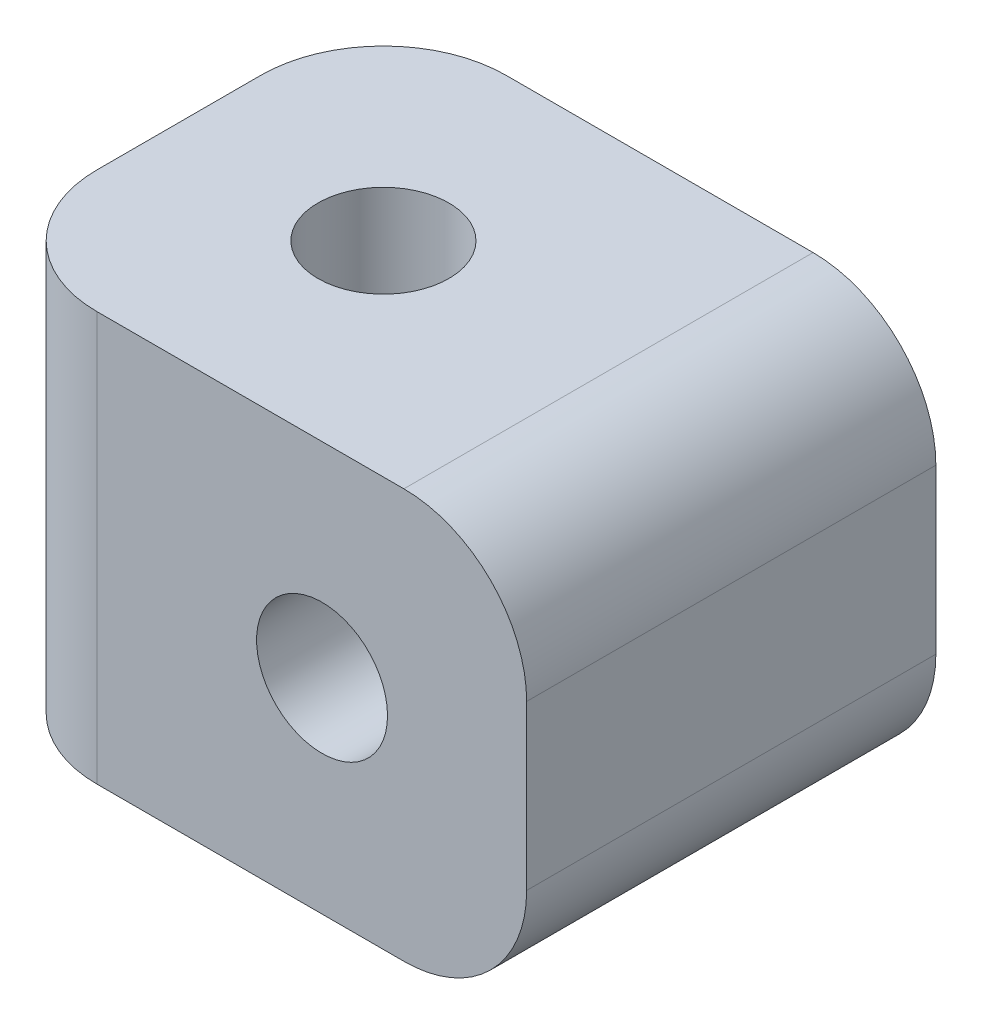
ISO-10303-21;
HEADER;
FILE_DESCRIPTION(('STEP AP214'),'2;1');
FILE_NAME('part.step','',(''),(''),'','','');
FILE_SCHEMA(('AUTOMOTIVE_DESIGN { 1 0 10303 214 1 1 1 1 }'));
ENDSEC;
DATA;
#1=APPLICATION_CONTEXT('core data for automotive mechanical design processes');
#2=APPLICATION_PROTOCOL_DEFINITION('international standard','automotive_design',2000,#1);
#3=PRODUCT_CONTEXT('',#1,'mechanical');
#4=PRODUCT('Part','Part','',(#3));
#5=PRODUCT_RELATED_PRODUCT_CATEGORY('part','',(#4));
#6=PRODUCT_DEFINITION_FORMATION('','',#4);
#7=PRODUCT_DEFINITION_CONTEXT('part definition',#1,'design');
#8=PRODUCT_DEFINITION('design','',#6,#7);
#9=PRODUCT_DEFINITION_SHAPE('','',#8);
#10=(LENGTH_UNIT() NAMED_UNIT(*) SI_UNIT(.MILLI.,.METRE.));
#11=(NAMED_UNIT(*) PLANE_ANGLE_UNIT() SI_UNIT($,.RADIAN.));
#12=(NAMED_UNIT(*) SI_UNIT($,.STERADIAN.) SOLID_ANGLE_UNIT());
#13=UNCERTAINTY_MEASURE_WITH_UNIT(LENGTH_MEASURE(1.E-05),#10,'distance_accuracy_value','');
#14=(GEOMETRIC_REPRESENTATION_CONTEXT(3) GLOBAL_UNCERTAINTY_ASSIGNED_CONTEXT((#13)) GLOBAL_UNIT_ASSIGNED_CONTEXT((#10,
#11,#12)) REPRESENTATION_CONTEXT('',''));
#15=CARTESIAN_POINT('',(0.,0.,0.));
#16=DIRECTION('',(0.,0.,1.));
#17=DIRECTION('',(1.,0.,0.));
#18=AXIS2_PLACEMENT_3D('',#15,#16,#17);
#19=CARTESIAN_POINT('',(0.,10.,0.));
#20=DIRECTION('',(1.,0.,0.));
#21=DIRECTION('',(0.,0.,-1.));
#22=AXIS2_PLACEMENT_3D('',#19,#20,#21);
#23=PLANE('',#22);
#24=DIRECTION('',(0.,0.,1.));
#25=VECTOR('',#24,1.);
#26=CARTESIAN_POINT('',(0.,10.,0.));
#27=LINE('',#26,#25);
#28=CARTESIAN_POINT('',(0.,10.,3.));
#29=VERTEX_POINT('',#28);
#30=CARTESIAN_POINT('',(0.,10.,7.));
#31=VERTEX_POINT('',#30);
#32=EDGE_CURVE('E118',#29,#31,#27,.T.);
#33=ORIENTED_EDGE('',*,*,#32,.F.);
#34=DIRECTION('',(0.,-1.,0.));
#35=VECTOR('',#34,1.);
#36=CARTESIAN_POINT('',(0.,10.,3.));
#37=LINE('',#36,#35);
#38=CARTESIAN_POINT('',(0.,0.,3.));
#39=VERTEX_POINT('',#38);
#40=EDGE_CURVE('E103',#29,#39,#37,.T.);
#41=ORIENTED_EDGE('',*,*,#40,.T.);
#42=DIRECTION('',(0.,0.,1.));
#43=VECTOR('',#42,1.);
#44=CARTESIAN_POINT('',(0.,0.,0.));
#45=LINE('',#44,#43);
#46=CARTESIAN_POINT('',(0.,0.,7.));
#47=VERTEX_POINT('',#46);
#48=EDGE_CURVE('E115',#39,#47,#45,.T.);
#49=ORIENTED_EDGE('',*,*,#48,.T.);
#50=DIRECTION('',(0.,-1.,0.));
#51=VECTOR('',#50,1.);
#52=CARTESIAN_POINT('',(0.,10.,7.));
#53=LINE('',#52,#51);
#54=EDGE_CURVE('E120',#47,#31,#53,.F.);
#55=ORIENTED_EDGE('',*,*,#54,.T.);
#56=EDGE_LOOP('',(#33,#41,#49,#55));
#57=FACE_BOUND('',#56,.T.);
#58=ADVANCED_FACE('F33',(#57),#23,.F.);
#59=CARTESIAN_POINT('',(0.,10.,10.));
#60=DIRECTION('',(0.,0.,-1.));
#61=DIRECTION('',(-1.,0.,0.));
#62=AXIS2_PLACEMENT_3D('',#59,#60,#61);
#63=PLANE('',#62);
#64=CARTESIAN_POINT('',(8.5,5.,10.));
#65=DIRECTION('',(0.,0.,1.));
#66=DIRECTION('',(1.,0.,0.));
#67=AXIS2_PLACEMENT_3D('',#64,#65,#66);
#68=CIRCLE('',#67,1.6);
#69=CARTESIAN_POINT('',(10.1,5.,10.));
#70=VERTEX_POINT('',#69);
#71=EDGE_CURVE('E130',#70,#70,#68,.T.);
#72=ORIENTED_EDGE('',*,*,#71,.F.);
#73=EDGE_LOOP('',(#72));
#74=FACE_BOUND('',#73,.T.);
#75=DIRECTION('',(1.,0.,0.));
#76=VECTOR('',#75,1.);
#77=CARTESIAN_POINT('',(0.,10.,10.));
#78=LINE('',#77,#76);
#79=CARTESIAN_POINT('',(3.,10.,10.));
#80=VERTEX_POINT('',#79);
#81=CARTESIAN_POINT('',(10.5,10.,10.));
#82=VERTEX_POINT('',#81);
#83=EDGE_CURVE('E165',#80,#82,#78,.T.);
#84=ORIENTED_EDGE('',*,*,#83,.F.);
#85=DIRECTION('',(0.,-1.,0.));
#86=VECTOR('',#85,1.);
#87=CARTESIAN_POINT('',(3.,10.,10.));
#88=LINE('',#87,#86);
#89=CARTESIAN_POINT('',(3.,0.,10.));
#90=VERTEX_POINT('',#89);
#91=EDGE_CURVE('E159',#80,#90,#88,.T.);
#92=ORIENTED_EDGE('',*,*,#91,.T.);
#93=DIRECTION('',(1.,0.,0.));
#94=VECTOR('',#93,1.);
#95=CARTESIAN_POINT('',(0.,0.,10.));
#96=LINE('',#95,#94);
#97=CARTESIAN_POINT('',(10.5,0.,10.));
#98=VERTEX_POINT('',#97);
#99=EDGE_CURVE('E124',#90,#98,#96,.T.);
#100=ORIENTED_EDGE('',*,*,#99,.T.);
#101=CARTESIAN_POINT('',(10.5,3.,10.));
#102=DIRECTION('',(0.,0.,-1.));
#103=DIRECTION('',(-1.,0.,0.));
#104=AXIS2_PLACEMENT_3D('',#101,#102,#103);
#105=CIRCLE('',#104,3.);
#106=CARTESIAN_POINT('',(13.5,3.,10.));
#107=VERTEX_POINT('',#106);
#108=EDGE_CURVE('E48',#98,#107,#105,.F.);
#109=ORIENTED_EDGE('',*,*,#108,.T.);
#110=DIRECTION('',(0.,-1.,0.));
#111=VECTOR('',#110,1.);
#112=CARTESIAN_POINT('',(13.5,10.,10.));
#113=LINE('',#112,#111);
#114=CARTESIAN_POINT('',(13.5,7.,10.));
#115=VERTEX_POINT('',#114);
#116=EDGE_CURVE('E140',#115,#107,#113,.T.);
#117=ORIENTED_EDGE('',*,*,#116,.F.);
#118=CARTESIAN_POINT('',(10.5,7.,10.));
#119=DIRECTION('',(0.,0.,-1.));
#120=DIRECTION('',(-1.,0.,0.));
#121=AXIS2_PLACEMENT_3D('',#118,#119,#120);
#122=CIRCLE('',#121,3.);
#123=EDGE_CURVE('E156',#115,#82,#122,.F.);
#124=ORIENTED_EDGE('',*,*,#123,.T.);
#125=EDGE_LOOP('',(#84,#92,#100,#109,#117,#124));
#126=FACE_BOUND('',#125,.T.);
#127=ADVANCED_FACE('F163',(#74,#126),#63,.F.);
#128=CARTESIAN_POINT('',(13.5,10.,0.));
#129=DIRECTION('',(-1.,0.,0.));
#130=DIRECTION('',(0.,0.,1.));
#131=AXIS2_PLACEMENT_3D('',#128,#129,#130);
#132=PLANE('',#131);
#133=ORIENTED_EDGE('',*,*,#116,.T.);
#134=DIRECTION('',(0.,0.,-1.));
#135=VECTOR('',#134,1.);
#136=CARTESIAN_POINT('',(13.5,3.,0.));
#137=LINE('',#136,#135);
#138=CARTESIAN_POINT('',(13.5,3.,0.));
#139=VERTEX_POINT('',#138);
#140=EDGE_CURVE('E11',#107,#139,#137,.T.);
#141=ORIENTED_EDGE('',*,*,#140,.T.);
#142=DIRECTION('',(0.,-1.,0.));
#143=VECTOR('',#142,1.);
#144=CARTESIAN_POINT('',(13.5,10.,0.));
#145=LINE('',#144,#143);
#146=CARTESIAN_POINT('',(13.5,7.,0.));
#147=VERTEX_POINT('',#146);
#148=EDGE_CURVE('E137',#147,#139,#145,.T.);
#149=ORIENTED_EDGE('',*,*,#148,.F.);
#150=DIRECTION('',(0.,0.,-1.));
#151=VECTOR('',#150,1.);
#152=CARTESIAN_POINT('',(13.5,7.,10.));
#153=LINE('',#152,#151);
#154=EDGE_CURVE('E41',#147,#115,#153,.F.);
#155=ORIENTED_EDGE('',*,*,#154,.T.);
#156=EDGE_LOOP('',(#133,#141,#149,#155));
#157=FACE_BOUND('',#156,.T.);
#158=ADVANCED_FACE('F172',(#157),#132,.F.);
#159=CARTESIAN_POINT('',(0.,10.,0.));
#160=DIRECTION('',(0.,0.,1.));
#161=DIRECTION('',(1.,0.,0.));
#162=AXIS2_PLACEMENT_3D('',#159,#160,#161);
#163=PLANE('',#162);
#164=CARTESIAN_POINT('',(8.5,5.,0.));
#165=DIRECTION('',(0.,0.,1.));
#166=DIRECTION('',(1.,0.,0.));
#167=AXIS2_PLACEMENT_3D('',#164,#165,#166);
#168=CIRCLE('',#167,1.6);
#169=CARTESIAN_POINT('',(10.1,5.,0.));
#170=VERTEX_POINT('',#169);
#171=EDGE_CURVE('E125',#170,#170,#168,.T.);
#172=ORIENTED_EDGE('',*,*,#171,.T.);
#173=EDGE_LOOP('',(#172));
#174=FACE_BOUND('',#173,.T.);
#175=DIRECTION('',(-1.,0.,0.));
#176=VECTOR('',#175,1.);
#177=CARTESIAN_POINT('',(0.,0.,0.));
#178=LINE('',#177,#176);
#179=CARTESIAN_POINT('',(10.5,0.,0.));
#180=VERTEX_POINT('',#179);
#181=CARTESIAN_POINT('',(3.,0.,0.));
#182=VERTEX_POINT('',#181);
#183=EDGE_CURVE('E127',#180,#182,#178,.T.);
#184=ORIENTED_EDGE('',*,*,#183,.T.);
#185=DIRECTION('',(0.,-1.,0.));
#186=VECTOR('',#185,1.);
#187=CARTESIAN_POINT('',(3.,10.,0.));
#188=LINE('',#187,#186);
#189=CARTESIAN_POINT('',(3.,10.,0.));
#190=VERTEX_POINT('',#189);
#191=EDGE_CURVE('E104',#182,#190,#188,.F.);
#192=ORIENTED_EDGE('',*,*,#191,.T.);
#193=DIRECTION('',(-1.,0.,0.));
#194=VECTOR('',#193,1.);
#195=CARTESIAN_POINT('',(0.,10.,0.));
#196=LINE('',#195,#194);
#197=CARTESIAN_POINT('',(10.5,10.,0.));
#198=VERTEX_POINT('',#197);
#199=EDGE_CURVE('E133',#198,#190,#196,.T.);
#200=ORIENTED_EDGE('',*,*,#199,.F.);
#201=CARTESIAN_POINT('',(10.5,7.,0.));
#202=DIRECTION('',(0.,0.,1.));
#203=DIRECTION('',(1.,0.,0.));
#204=AXIS2_PLACEMENT_3D('',#201,#202,#203);
#205=CIRCLE('',#204,3.);
#206=EDGE_CURVE('E109',#198,#147,#205,.F.);
#207=ORIENTED_EDGE('',*,*,#206,.T.);
#208=ORIENTED_EDGE('',*,*,#148,.T.);
#209=CARTESIAN_POINT('',(10.5,3.,0.));
#210=DIRECTION('',(0.,0.,1.));
#211=DIRECTION('',(1.,0.,0.));
#212=AXIS2_PLACEMENT_3D('',#209,#210,#211);
#213=CIRCLE('',#212,3.);
#214=EDGE_CURVE('E146',#139,#180,#213,.F.);
#215=ORIENTED_EDGE('',*,*,#214,.T.);
#216=EDGE_LOOP('',(#184,#192,#200,#207,#208,#215));
#217=FACE_BOUND('',#216,.T.);
#218=ADVANCED_FACE('F174',(#174,#217),#163,.F.);
#219=CARTESIAN_POINT('',(0.,10.,0.));
#220=DIRECTION('',(0.,1.,0.));
#221=DIRECTION('',(0.,0.,1.));
#222=AXIS2_PLACEMENT_3D('',#219,#220,#221);
#223=PLANE('',#222);
#224=CARTESIAN_POINT('',(5.,10.,5.));
#225=DIRECTION('',(0.,1.,0.));
#226=DIRECTION('',(0.,0.,1.));
#227=AXIS2_PLACEMENT_3D('',#224,#225,#226);
#228=CIRCLE('',#227,1.6);
#229=CARTESIAN_POINT('',(5.,10.,6.6));
#230=VERTEX_POINT('',#229);
#231=EDGE_CURVE('E187',#230,#230,#228,.T.);
#232=ORIENTED_EDGE('',*,*,#231,.F.);
#233=EDGE_LOOP('',(#232));
#234=FACE_BOUND('',#233,.T.);
#235=ORIENTED_EDGE('',*,*,#199,.T.);
#236=CARTESIAN_POINT('',(3.,10.,3.));
#237=DIRECTION('',(0.,1.,0.));
#238=DIRECTION('',(0.,0.,1.));
#239=AXIS2_PLACEMENT_3D('',#236,#237,#238);
#240=CIRCLE('',#239,3.);
#241=EDGE_CURVE('E154',#190,#29,#240,.T.);
#242=ORIENTED_EDGE('',*,*,#241,.T.);
#243=ORIENTED_EDGE('',*,*,#32,.T.);
#244=CARTESIAN_POINT('',(3.,10.,7.));
#245=DIRECTION('',(0.,1.,0.));
#246=DIRECTION('',(0.,0.,1.));
#247=AXIS2_PLACEMENT_3D('',#244,#245,#246);
#248=CIRCLE('',#247,3.);
#249=EDGE_CURVE('E152',#31,#80,#248,.T.);
#250=ORIENTED_EDGE('',*,*,#249,.T.);
#251=ORIENTED_EDGE('',*,*,#83,.T.);
#252=DIRECTION('',(0.,0.,-1.));
#253=VECTOR('',#252,1.);
#254=CARTESIAN_POINT('',(10.5,10.,0.));
#255=LINE('',#254,#253);
#256=EDGE_CURVE('E149',#82,#198,#255,.T.);
#257=ORIENTED_EDGE('',*,*,#256,.T.);
#258=EDGE_LOOP('',(#235,#242,#243,#250,#251,#257));
#259=FACE_BOUND('',#258,.T.);
#260=ADVANCED_FACE('F181',(#234,#259),#223,.T.);
#261=CARTESIAN_POINT('',(0.,0.,0.));
#262=DIRECTION('',(0.,1.,0.));
#263=DIRECTION('',(0.,0.,1.));
#264=AXIS2_PLACEMENT_3D('',#261,#262,#263);
#265=PLANE('',#264);
#266=CARTESIAN_POINT('',(5.,0.,5.));
#267=DIRECTION('',(0.,1.,0.));
#268=DIRECTION('',(0.,0.,1.));
#269=AXIS2_PLACEMENT_3D('',#266,#267,#268);
#270=CIRCLE('',#269,1.6);
#271=CARTESIAN_POINT('',(5.,0.,6.6));
#272=VERTEX_POINT('',#271);
#273=EDGE_CURVE('E185',#272,#272,#270,.T.);
#274=ORIENTED_EDGE('',*,*,#273,.T.);
#275=EDGE_LOOP('',(#274));
#276=FACE_BOUND('',#275,.T.);
#277=ORIENTED_EDGE('',*,*,#48,.F.);
#278=CARTESIAN_POINT('',(3.,0.,3.));
#279=DIRECTION('',(0.,1.,0.));
#280=DIRECTION('',(0.,0.,1.));
#281=AXIS2_PLACEMENT_3D('',#278,#279,#280);
#282=CIRCLE('',#281,3.);
#283=EDGE_CURVE('E99',#39,#182,#282,.F.);
#284=ORIENTED_EDGE('',*,*,#283,.T.);
#285=ORIENTED_EDGE('',*,*,#183,.F.);
#286=DIRECTION('',(0.,0.,-1.));
#287=VECTOR('',#286,1.);
#288=CARTESIAN_POINT('',(10.5,0.,0.));
#289=LINE('',#288,#287);
#290=EDGE_CURVE('E119',#180,#98,#289,.F.);
#291=ORIENTED_EDGE('',*,*,#290,.T.);
#292=ORIENTED_EDGE('',*,*,#99,.F.);
#293=CARTESIAN_POINT('',(3.,0.,7.));
#294=DIRECTION('',(0.,1.,0.));
#295=DIRECTION('',(0.,0.,1.));
#296=AXIS2_PLACEMENT_3D('',#293,#294,#295);
#297=CIRCLE('',#296,3.);
#298=EDGE_CURVE('E110',#90,#47,#297,.F.);
#299=ORIENTED_EDGE('',*,*,#298,.T.);
#300=EDGE_LOOP('',(#277,#284,#285,#291,#292,#299));
#301=FACE_BOUND('',#300,.T.);
#302=ADVANCED_FACE('F122',(#276,#301),#265,.F.);
#303=CARTESIAN_POINT('',(8.5,5.,0.));
#304=DIRECTION('',(0.,0.,1.));
#305=DIRECTION('',(1.,0.,0.));
#306=AXIS2_PLACEMENT_3D('',#303,#304,#305);
#307=CYLINDRICAL_SURFACE('',#306,1.6);
#308=ORIENTED_EDGE('',*,*,#171,.F.);
#309=EDGE_LOOP('',(#308));
#310=FACE_BOUND('',#309,.T.);
#311=ORIENTED_EDGE('',*,*,#71,.T.);
#312=EDGE_LOOP('',(#311));
#313=FACE_BOUND('',#312,.T.);
#314=ADVANCED_FACE('F197',(#310,#313),#307,.F.);
#315=CARTESIAN_POINT('',(5.,0.,5.));
#316=DIRECTION('',(0.,1.,0.));
#317=DIRECTION('',(0.,0.,1.));
#318=AXIS2_PLACEMENT_3D('',#315,#316,#317);
#319=CYLINDRICAL_SURFACE('',#318,1.6);
#320=ORIENTED_EDGE('',*,*,#273,.F.);
#321=EDGE_LOOP('',(#320));
#322=FACE_BOUND('',#321,.T.);
#323=ORIENTED_EDGE('',*,*,#231,.T.);
#324=EDGE_LOOP('',(#323));
#325=FACE_BOUND('',#324,.T.);
#326=ADVANCED_FACE('F194',(#322,#325),#319,.F.);
#327=CARTESIAN_POINT('',(3.,10.,3.));
#328=DIRECTION('',(0.,-1.,0.));
#329=DIRECTION('',(0.,0.,-1.));
#330=AXIS2_PLACEMENT_3D('',#327,#328,#329);
#331=CYLINDRICAL_SURFACE('',#330,3.);
#332=ORIENTED_EDGE('',*,*,#241,.F.);
#333=ORIENTED_EDGE('',*,*,#191,.F.);
#334=ORIENTED_EDGE('',*,*,#283,.F.);
#335=ORIENTED_EDGE('',*,*,#40,.F.);
#336=EDGE_LOOP('',(#332,#333,#334,#335));
#337=FACE_BOUND('',#336,.T.);
#338=ADVANCED_FACE('F102',(#337),#331,.T.);
#339=CARTESIAN_POINT('',(3.,10.,7.));
#340=DIRECTION('',(0.,-1.,0.));
#341=DIRECTION('',(0.,0.,-1.));
#342=AXIS2_PLACEMENT_3D('',#339,#340,#341);
#343=CYLINDRICAL_SURFACE('',#342,3.);
#344=ORIENTED_EDGE('',*,*,#249,.F.);
#345=ORIENTED_EDGE('',*,*,#54,.F.);
#346=ORIENTED_EDGE('',*,*,#298,.F.);
#347=ORIENTED_EDGE('',*,*,#91,.F.);
#348=EDGE_LOOP('',(#344,#345,#346,#347));
#349=FACE_BOUND('',#348,.T.);
#350=ADVANCED_FACE('F223',(#349),#343,.T.);
#351=CARTESIAN_POINT('',(10.5,3.,0.));
#352=DIRECTION('',(0.,0.,-1.));
#353=DIRECTION('',(-1.,0.,0.));
#354=AXIS2_PLACEMENT_3D('',#351,#352,#353);
#355=CYLINDRICAL_SURFACE('',#354,3.);
#356=ORIENTED_EDGE('',*,*,#108,.F.);
#357=ORIENTED_EDGE('',*,*,#290,.F.);
#358=ORIENTED_EDGE('',*,*,#214,.F.);
#359=ORIENTED_EDGE('',*,*,#140,.F.);
#360=EDGE_LOOP('',(#356,#357,#358,#359));
#361=FACE_BOUND('',#360,.T.);
#362=ADVANCED_FACE('F170',(#361),#355,.T.);
#363=CARTESIAN_POINT('',(10.5,7.,0.));
#364=DIRECTION('',(0.,0.,1.));
#365=DIRECTION('',(1.,0.,0.));
#366=AXIS2_PLACEMENT_3D('',#363,#364,#365);
#367=CYLINDRICAL_SURFACE('',#366,3.);
#368=ORIENTED_EDGE('',*,*,#123,.F.);
#369=ORIENTED_EDGE('',*,*,#154,.F.);
#370=ORIENTED_EDGE('',*,*,#206,.F.);
#371=ORIENTED_EDGE('',*,*,#256,.F.);
#372=EDGE_LOOP('',(#368,#369,#370,#371));
#373=FACE_BOUND('',#372,.T.);
#374=ADVANCED_FACE('F35',(#373),#367,.T.);
#375=CLOSED_SHELL('',(#58,#127,#158,#218,#260,#302,#314,#326,#338,#350,#362,#374));
#376=MANIFOLD_SOLID_BREP('B2',#375);
#377=ADVANCED_BREP_SHAPE_REPRESENTATION('',(#18,#376),#14);
#378=SHAPE_DEFINITION_REPRESENTATION(#9,#377);
ENDSEC;
END-ISO-10303-21;
